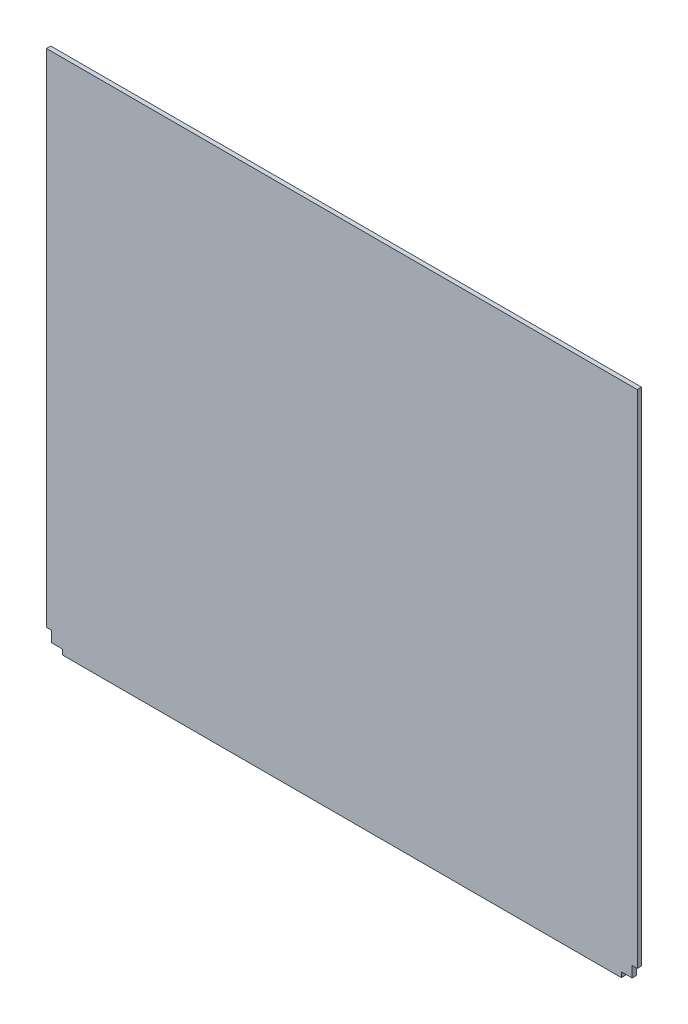
ISO-10303-21;
HEADER;
FILE_DESCRIPTION(('STEP AP214'),'2;1');
FILE_NAME('part.step','',(''),(''),'','','');
FILE_SCHEMA(('AUTOMOTIVE_DESIGN { 1 0 10303 214 1 1 1 1 }'));
ENDSEC;
DATA;
#1=APPLICATION_CONTEXT('core data for automotive mechanical design processes');
#2=APPLICATION_PROTOCOL_DEFINITION('international standard','automotive_design',2000,#1);
#3=PRODUCT_CONTEXT('',#1,'mechanical');
#4=PRODUCT('Part','Part','',(#3));
#5=PRODUCT_RELATED_PRODUCT_CATEGORY('part','',(#4));
#6=PRODUCT_DEFINITION_FORMATION('','',#4);
#7=PRODUCT_DEFINITION_CONTEXT('part definition',#1,'design');
#8=PRODUCT_DEFINITION('design','',#6,#7);
#9=PRODUCT_DEFINITION_SHAPE('','',#8);
#10=(LENGTH_UNIT() NAMED_UNIT(*) SI_UNIT(.MILLI.,.METRE.));
#11=(NAMED_UNIT(*) PLANE_ANGLE_UNIT() SI_UNIT($,.RADIAN.));
#12=(NAMED_UNIT(*) SI_UNIT($,.STERADIAN.) SOLID_ANGLE_UNIT());
#13=UNCERTAINTY_MEASURE_WITH_UNIT(LENGTH_MEASURE(1.E-05),#10,'distance_accuracy_value','');
#14=(GEOMETRIC_REPRESENTATION_CONTEXT(3) GLOBAL_UNCERTAINTY_ASSIGNED_CONTEXT((#13)) GLOBAL_UNIT_ASSIGNED_CONTEXT((#10,
#11,#12)) REPRESENTATION_CONTEXT('',''));
#15=CARTESIAN_POINT('',(0.,0.,0.));
#16=DIRECTION('',(0.,0.,1.));
#17=DIRECTION('',(1.,0.,0.));
#18=AXIS2_PLACEMENT_3D('',#15,#16,#17);
#19=CARTESIAN_POINT('',(0.,16.1250881688966,6.34999999999986));
#20=DIRECTION('',(1.,0.,0.));
#21=DIRECTION('',(0.,1.,0.));
#22=AXIS2_PLACEMENT_3D('',#19,#20,#21);
#23=PLANE('',#22);
#24=DIRECTION('',(0.,-1.,0.));
#25=VECTOR('',#24,1.);
#26=CARTESIAN_POINT('',(0.,16.1250881688966,0.));
#27=LINE('',#26,#25);
#28=CARTESIAN_POINT('',(0.,16.1250881688966,0.));
#29=VERTEX_POINT('',#28);
#30=CARTESIAN_POINT('',(0.,0.,0.));
#31=VERTEX_POINT('',#30);
#32=EDGE_CURVE('E166',#29,#31,#27,.T.);
#33=ORIENTED_EDGE('',*,*,#32,.T.);
#34=DIRECTION('',(0.,0.,-1.));
#35=VECTOR('',#34,1.);
#36=CARTESIAN_POINT('',(0.,0.,6.34999999999986));
#37=LINE('',#36,#35);
#38=CARTESIAN_POINT('',(0.,0.,6.34999999999986));
#39=VERTEX_POINT('',#38);
#40=EDGE_CURVE('E11',#39,#31,#37,.T.);
#41=ORIENTED_EDGE('',*,*,#40,.F.);
#42=DIRECTION('',(0.,-1.,0.));
#43=VECTOR('',#42,1.);
#44=CARTESIAN_POINT('',(0.,16.1250881688966,6.34999999999986));
#45=LINE('',#44,#43);
#46=CARTESIAN_POINT('',(0.,16.1250881688966,6.34999999999986));
#47=VERTEX_POINT('',#46);
#48=EDGE_CURVE('E200',#47,#39,#45,.T.);
#49=ORIENTED_EDGE('',*,*,#48,.F.);
#50=DIRECTION('',(0.,0.,-1.));
#51=VECTOR('',#50,1.);
#52=CARTESIAN_POINT('',(0.,16.1250881688966,6.34999999999986));
#53=LINE('',#52,#51);
#54=EDGE_CURVE('E162',#47,#29,#53,.T.);
#55=ORIENTED_EDGE('',*,*,#54,.T.);
#56=EDGE_LOOP('',(#33,#41,#49,#55));
#57=FACE_BOUND('',#56,.T.);
#58=ADVANCED_FACE('F40',(#57),#23,.F.);
#59=CARTESIAN_POINT('',(0.,0.,6.34999999999986));
#60=DIRECTION('',(0.,1.,0.));
#61=DIRECTION('',(0.,0.,1.));
#62=AXIS2_PLACEMENT_3D('',#59,#60,#61);
#63=PLANE('',#62);
#64=DIRECTION('',(1.,0.,0.));
#65=VECTOR('',#64,1.);
#66=CARTESIAN_POINT('',(0.,0.,0.));
#67=LINE('',#66,#65);
#68=CARTESIAN_POINT('',(16.1250881688966,0.,0.));
#69=VERTEX_POINT('',#68);
#70=EDGE_CURVE('E170',#31,#69,#67,.T.);
#71=ORIENTED_EDGE('',*,*,#70,.T.);
#72=DIRECTION('',(0.,0.,-1.));
#73=VECTOR('',#72,1.);
#74=CARTESIAN_POINT('',(16.1250881688966,0.,6.34999999999986));
#75=LINE('',#74,#73);
#76=CARTESIAN_POINT('',(16.1250881688966,0.,6.34999999999986));
#77=VERTEX_POINT('',#76);
#78=EDGE_CURVE('E49',#77,#69,#75,.T.);
#79=ORIENTED_EDGE('',*,*,#78,.F.);
#80=DIRECTION('',(1.,0.,0.));
#81=VECTOR('',#80,1.);
#82=CARTESIAN_POINT('',(0.,0.,6.34999999999986));
#83=LINE('',#82,#81);
#84=EDGE_CURVE('E112',#39,#77,#83,.T.);
#85=ORIENTED_EDGE('',*,*,#84,.F.);
#86=ORIENTED_EDGE('',*,*,#40,.T.);
#87=EDGE_LOOP('',(#71,#79,#85,#86));
#88=FACE_BOUND('',#87,.T.);
#89=ADVANCED_FACE('F301',(#88),#63,.F.);
#90=CARTESIAN_POINT('',(16.1250881688966,-7.61999999999996,6.34999999999986));
#91=DIRECTION('',(1.,0.,0.));
#92=DIRECTION('',(0.,0.,-1.));
#93=AXIS2_PLACEMENT_3D('',#90,#91,#92);
#94=PLANE('',#93);
#95=DIRECTION('',(0.,-1.,0.));
#96=VECTOR('',#95,1.);
#97=CARTESIAN_POINT('',(16.1250881688966,-7.61999999999996,0.));
#98=LINE('',#97,#96);
#99=CARTESIAN_POINT('',(16.1250881688966,-7.61999999999996,0.));
#100=VERTEX_POINT('',#99);
#101=EDGE_CURVE('E173',#69,#100,#98,.T.);
#102=ORIENTED_EDGE('',*,*,#101,.T.);
#103=DIRECTION('',(0.,0.,-1.));
#104=VECTOR('',#103,1.);
#105=CARTESIAN_POINT('',(16.1250881688966,-7.61999999999996,6.34999999999986));
#106=LINE('',#105,#104);
#107=CARTESIAN_POINT('',(16.1250881688966,-7.61999999999996,6.34999999999986));
#108=VERTEX_POINT('',#107);
#109=EDGE_CURVE('E227',#108,#100,#106,.T.);
#110=ORIENTED_EDGE('',*,*,#109,.F.);
#111=DIRECTION('',(0.,-1.,0.));
#112=VECTOR('',#111,1.);
#113=CARTESIAN_POINT('',(16.1250881688966,-7.61999999999996,6.34999999999986));
#114=LINE('',#113,#112);
#115=EDGE_CURVE('E238',#77,#108,#114,.T.);
#116=ORIENTED_EDGE('',*,*,#115,.F.);
#117=ORIENTED_EDGE('',*,*,#78,.T.);
#118=EDGE_LOOP('',(#102,#110,#116,#117));
#119=FACE_BOUND('',#118,.T.);
#120=ADVANCED_FACE('F236',(#119),#94,.F.);
#121=CARTESIAN_POINT('',(848.236911831105,-7.61999999999985,6.3500000000003));
#122=DIRECTION('',(0.,1.,0.));
#123=DIRECTION('',(-1.,0.,0.));
#124=AXIS2_PLACEMENT_3D('',#121,#122,#123);
#125=PLANE('',#124);
#126=DIRECTION('',(1.,0.,0.));
#127=VECTOR('',#126,1.);
#128=CARTESIAN_POINT('',(848.236911831105,-7.61999999999985,0.));
#129=LINE('',#128,#127);
#130=CARTESIAN_POINT('',(848.236911831105,-7.61999999999985,0.));
#131=VERTEX_POINT('',#130);
#132=EDGE_CURVE('E176',#100,#131,#129,.T.);
#133=ORIENTED_EDGE('',*,*,#132,.T.);
#134=DIRECTION('',(0.,0.,-1.));
#135=VECTOR('',#134,1.);
#136=CARTESIAN_POINT('',(848.236911831105,-7.61999999999985,6.3500000000003));
#137=LINE('',#136,#135);
#138=CARTESIAN_POINT('',(848.236911831105,-7.61999999999985,6.3500000000003));
#139=VERTEX_POINT('',#138);
#140=EDGE_CURVE('E223',#139,#131,#137,.T.);
#141=ORIENTED_EDGE('',*,*,#140,.F.);
#142=DIRECTION('',(1.,0.,0.));
#143=VECTOR('',#142,1.);
#144=CARTESIAN_POINT('',(848.236911831105,-7.61999999999985,6.3500000000003));
#145=LINE('',#144,#143);
#146=EDGE_CURVE('E257',#108,#139,#145,.T.);
#147=ORIENTED_EDGE('',*,*,#146,.F.);
#148=ORIENTED_EDGE('',*,*,#109,.T.);
#149=EDGE_LOOP('',(#133,#141,#147,#148));
#150=FACE_BOUND('',#149,.T.);
#151=ADVANCED_FACE('F247',(#150),#125,.F.);
#152=CARTESIAN_POINT('',(848.236911831105,-7.61999999999985,6.3500000000003));
#153=DIRECTION('',(-1.,0.,0.));
#154=DIRECTION('',(0.,0.,1.));
#155=AXIS2_PLACEMENT_3D('',#152,#153,#154);
#156=PLANE('',#155);
#157=DIRECTION('',(0.,1.,0.));
#158=VECTOR('',#157,1.);
#159=CARTESIAN_POINT('',(848.236911831105,-7.61999999999985,0.));
#160=LINE('',#159,#158);
#161=CARTESIAN_POINT('',(848.236911831105,2.22044604925031E-13,0.));
#162=VERTEX_POINT('',#161);
#163=EDGE_CURVE('E179',#131,#162,#160,.T.);
#164=ORIENTED_EDGE('',*,*,#163,.T.);
#165=DIRECTION('',(0.,0.,-1.));
#166=VECTOR('',#165,1.);
#167=CARTESIAN_POINT('',(848.236911831105,2.22044604925031E-13,6.3500000000003));
#168=LINE('',#167,#166);
#169=CARTESIAN_POINT('',(848.236911831105,2.22044604925031E-13,6.3500000000003));
#170=VERTEX_POINT('',#169);
#171=EDGE_CURVE('E219',#170,#162,#168,.T.);
#172=ORIENTED_EDGE('',*,*,#171,.F.);
#173=DIRECTION('',(0.,1.,0.));
#174=VECTOR('',#173,1.);
#175=CARTESIAN_POINT('',(848.236911831105,-7.61999999999985,6.3500000000003));
#176=LINE('',#175,#174);
#177=EDGE_CURVE('E253',#139,#170,#176,.T.);
#178=ORIENTED_EDGE('',*,*,#177,.F.);
#179=ORIENTED_EDGE('',*,*,#140,.T.);
#180=EDGE_LOOP('',(#164,#172,#178,#179));
#181=FACE_BOUND('',#180,.T.);
#182=ADVANCED_FACE('F251',(#181),#156,.F.);
#183=CARTESIAN_POINT('',(864.362000000002,2.22044604925031E-13,6.34999999999941));
#184=DIRECTION('',(0.,1.,0.));
#185=DIRECTION('',(-1.,0.,0.));
#186=AXIS2_PLACEMENT_3D('',#183,#184,#185);
#187=PLANE('',#186);
#188=DIRECTION('',(1.,0.,0.));
#189=VECTOR('',#188,1.);
#190=CARTESIAN_POINT('',(864.362000000002,2.22044604925031E-13,-8.88178419700125E-13));
#191=LINE('',#190,#189);
#192=CARTESIAN_POINT('',(864.362000000002,2.22044604925031E-13,-8.88178419700125E-13));
#193=VERTEX_POINT('',#192);
#194=EDGE_CURVE('E182',#162,#193,#191,.T.);
#195=ORIENTED_EDGE('',*,*,#194,.T.);
#196=DIRECTION('',(0.,0.,-1.));
#197=VECTOR('',#196,1.);
#198=CARTESIAN_POINT('',(864.362000000002,2.22044604925031E-13,6.34999999999941));
#199=LINE('',#198,#197);
#200=CARTESIAN_POINT('',(864.362000000002,2.22044604925031E-13,6.34999999999941));
#201=VERTEX_POINT('',#200);
#202=EDGE_CURVE('E215',#201,#193,#199,.T.);
#203=ORIENTED_EDGE('',*,*,#202,.F.);
#204=DIRECTION('',(1.,0.,0.));
#205=VECTOR('',#204,1.);
#206=CARTESIAN_POINT('',(864.362000000002,2.22044604925031E-13,6.34999999999941));
#207=LINE('',#206,#205);
#208=EDGE_CURVE('E256',#170,#201,#207,.T.);
#209=ORIENTED_EDGE('',*,*,#208,.F.);
#210=ORIENTED_EDGE('',*,*,#171,.T.);
#211=EDGE_LOOP('',(#195,#203,#209,#210));
#212=FACE_BOUND('',#211,.T.);
#213=ADVANCED_FACE('F314',(#212),#187,.F.);
#214=CARTESIAN_POINT('',(864.362000000002,16.1250881688968,6.34999999999941));
#215=DIRECTION('',(-1.,0.,0.));
#216=DIRECTION('',(0.,0.,1.));
#217=AXIS2_PLACEMENT_3D('',#214,#215,#216);
#218=PLANE('',#217);
#219=DIRECTION('',(0.,1.,0.));
#220=VECTOR('',#219,1.);
#221=CARTESIAN_POINT('',(864.362000000002,16.1250881688968,-8.88178419700125E-13));
#222=LINE('',#221,#220);
#223=CARTESIAN_POINT('',(864.362000000002,16.1250881688968,-8.88178419700125E-13));
#224=VERTEX_POINT('',#223);
#225=EDGE_CURVE('E185',#193,#224,#222,.T.);
#226=ORIENTED_EDGE('',*,*,#225,.T.);
#227=DIRECTION('',(0.,0.,-1.));
#228=VECTOR('',#227,1.);
#229=CARTESIAN_POINT('',(864.362000000002,16.1250881688968,6.34999999999941));
#230=LINE('',#229,#228);
#231=CARTESIAN_POINT('',(864.362000000002,16.1250881688968,6.34999999999941));
#232=VERTEX_POINT('',#231);
#233=EDGE_CURVE('E211',#232,#224,#230,.T.);
#234=ORIENTED_EDGE('',*,*,#233,.F.);
#235=DIRECTION('',(0.,1.,0.));
#236=VECTOR('',#235,1.);
#237=CARTESIAN_POINT('',(864.362000000002,16.1250881688968,6.34999999999941));
#238=LINE('',#237,#236);
#239=EDGE_CURVE('E262',#201,#232,#238,.T.);
#240=ORIENTED_EDGE('',*,*,#239,.F.);
#241=ORIENTED_EDGE('',*,*,#202,.T.);
#242=EDGE_LOOP('',(#226,#234,#240,#241));
#243=FACE_BOUND('',#242,.T.);
#244=ADVANCED_FACE('F317',(#243),#218,.F.);
#245=CARTESIAN_POINT('',(864.362000000002,16.1250881688968,6.34999999999941));
#246=DIRECTION('',(0.,1.,0.));
#247=DIRECTION('',(-1.,0.,0.));
#248=AXIS2_PLACEMENT_3D('',#245,#246,#247);
#249=PLANE('',#248);
#250=DIRECTION('',(1.,0.,0.));
#251=VECTOR('',#250,1.);
#252=CARTESIAN_POINT('',(864.362000000002,16.1250881688968,-8.88178419700125E-13));
#253=LINE('',#252,#251);
#254=CARTESIAN_POINT('',(871.982000000002,16.1250881688968,-8.88178419700125E-13));
#255=VERTEX_POINT('',#254);
#256=EDGE_CURVE('E188',#224,#255,#253,.T.);
#257=ORIENTED_EDGE('',*,*,#256,.T.);
#258=DIRECTION('',(0.,0.,-1.));
#259=VECTOR('',#258,1.);
#260=CARTESIAN_POINT('',(871.982000000002,16.1250881688968,6.34999999999941));
#261=LINE('',#260,#259);
#262=CARTESIAN_POINT('',(871.982000000002,16.1250881688968,6.34999999999941));
#263=VERTEX_POINT('',#262);
#264=EDGE_CURVE('E207',#263,#255,#261,.T.);
#265=ORIENTED_EDGE('',*,*,#264,.F.);
#266=DIRECTION('',(1.,0.,0.));
#267=VECTOR('',#266,1.);
#268=CARTESIAN_POINT('',(864.362000000002,16.1250881688968,6.34999999999941));
#269=LINE('',#268,#267);
#270=EDGE_CURVE('E269',#232,#263,#269,.T.);
#271=ORIENTED_EDGE('',*,*,#270,.F.);
#272=ORIENTED_EDGE('',*,*,#233,.T.);
#273=EDGE_LOOP('',(#257,#265,#271,#272));
#274=FACE_BOUND('',#273,.T.);
#275=ADVANCED_FACE('F282',(#274),#249,.F.);
#276=CARTESIAN_POINT('',(871.982000000001,762.508,6.34999999999941));
#277=DIRECTION('',(-1.,0.,0.));
#278=DIRECTION('',(0.,-1.,0.));
#279=AXIS2_PLACEMENT_3D('',#276,#277,#278);
#280=PLANE('',#279);
#281=DIRECTION('',(0.,1.,0.));
#282=VECTOR('',#281,1.);
#283=CARTESIAN_POINT('',(871.982000000001,762.508,-8.88178419700125E-13));
#284=LINE('',#283,#282);
#285=CARTESIAN_POINT('',(871.982000000001,762.508,-8.88178419700125E-13));
#286=VERTEX_POINT('',#285);
#287=EDGE_CURVE('E191',#255,#286,#284,.T.);
#288=ORIENTED_EDGE('',*,*,#287,.T.);
#289=DIRECTION('',(0.,0.,-1.));
#290=VECTOR('',#289,1.);
#291=CARTESIAN_POINT('',(871.982000000001,762.508,6.34999999999941));
#292=LINE('',#291,#290);
#293=CARTESIAN_POINT('',(871.982000000001,762.508,6.34999999999941));
#294=VERTEX_POINT('',#293);
#295=EDGE_CURVE('E154',#294,#286,#292,.T.);
#296=ORIENTED_EDGE('',*,*,#295,.F.);
#297=DIRECTION('',(0.,1.,0.));
#298=VECTOR('',#297,1.);
#299=CARTESIAN_POINT('',(871.982000000001,762.508,6.34999999999941));
#300=LINE('',#299,#298);
#301=EDGE_CURVE('E143',#263,#294,#300,.T.);
#302=ORIENTED_EDGE('',*,*,#301,.F.);
#303=ORIENTED_EDGE('',*,*,#264,.T.);
#304=EDGE_LOOP('',(#288,#296,#302,#303));
#305=FACE_BOUND('',#304,.T.);
#306=ADVANCED_FACE('F286',(#305),#280,.F.);
#307=CARTESIAN_POINT('',(-7.62000000000001,762.508,6.34999999999986));
#308=DIRECTION('',(0.,-1.,0.));
#309=DIRECTION('',(1.,0.,0.));
#310=AXIS2_PLACEMENT_3D('',#307,#308,#309);
#311=PLANE('',#310);
#312=DIRECTION('',(-1.,0.,0.));
#313=VECTOR('',#312,1.);
#314=CARTESIAN_POINT('',(-7.62000000000002,762.508,0.));
#315=LINE('',#314,#313);
#316=CARTESIAN_POINT('',(-7.62000000000002,762.508,0.));
#317=VERTEX_POINT('',#316);
#318=EDGE_CURVE('E152',#286,#317,#315,.T.);
#319=ORIENTED_EDGE('',*,*,#318,.T.);
#320=DIRECTION('',(0.,0.,-1.));
#321=VECTOR('',#320,1.);
#322=CARTESIAN_POINT('',(-7.62000000000001,762.508,6.34999999999986));
#323=LINE('',#322,#321);
#324=CARTESIAN_POINT('',(-7.62000000000001,762.508,6.34999999999986));
#325=VERTEX_POINT('',#324);
#326=EDGE_CURVE('E149',#325,#317,#323,.T.);
#327=ORIENTED_EDGE('',*,*,#326,.F.);
#328=DIRECTION('',(-1.,0.,0.));
#329=VECTOR('',#328,1.);
#330=CARTESIAN_POINT('',(-7.62000000000001,762.508,6.34999999999986));
#331=LINE('',#330,#329);
#332=EDGE_CURVE('E137',#294,#325,#331,.T.);
#333=ORIENTED_EDGE('',*,*,#332,.F.);
#334=ORIENTED_EDGE('',*,*,#295,.T.);
#335=EDGE_LOOP('',(#319,#327,#333,#334));
#336=FACE_BOUND('',#335,.T.);
#337=ADVANCED_FACE('F150',(#336),#311,.F.);
#338=CARTESIAN_POINT('',(-7.62000000000001,16.1250881688966,6.34999999999986));
#339=DIRECTION('',(1.,0.,0.));
#340=DIRECTION('',(0.,1.,0.));
#341=AXIS2_PLACEMENT_3D('',#338,#339,#340);
#342=PLANE('',#341);
#343=DIRECTION('',(0.,-1.,0.));
#344=VECTOR('',#343,1.);
#345=CARTESIAN_POINT('',(-7.62000000000002,16.1250881688966,0.));
#346=LINE('',#345,#344);
#347=CARTESIAN_POINT('',(-7.62000000000002,16.1250881688966,0.));
#348=VERTEX_POINT('',#347);
#349=EDGE_CURVE('E98',#317,#348,#346,.T.);
#350=ORIENTED_EDGE('',*,*,#349,.T.);
#351=DIRECTION('',(0.,0.,-1.));
#352=VECTOR('',#351,1.);
#353=CARTESIAN_POINT('',(-7.62000000000001,16.1250881688966,6.34999999999986));
#354=LINE('',#353,#352);
#355=CARTESIAN_POINT('',(-7.62000000000001,16.1250881688966,6.34999999999986));
#356=VERTEX_POINT('',#355);
#357=EDGE_CURVE('E155',#356,#348,#354,.T.);
#358=ORIENTED_EDGE('',*,*,#357,.F.);
#359=DIRECTION('',(0.,-1.,0.));
#360=VECTOR('',#359,1.);
#361=CARTESIAN_POINT('',(-7.62000000000001,16.1250881688966,6.34999999999986));
#362=LINE('',#361,#360);
#363=EDGE_CURVE('E141',#325,#356,#362,.T.);
#364=ORIENTED_EDGE('',*,*,#363,.F.);
#365=ORIENTED_EDGE('',*,*,#326,.T.);
#366=EDGE_LOOP('',(#350,#358,#364,#365));
#367=FACE_BOUND('',#366,.T.);
#368=ADVANCED_FACE('F157',(#367),#342,.F.);
#369=CARTESIAN_POINT('',(0.,16.1250881688966,6.34999999999986));
#370=DIRECTION('',(0.,1.,0.));
#371=DIRECTION('',(0.,0.,1.));
#372=AXIS2_PLACEMENT_3D('',#369,#370,#371);
#373=PLANE('',#372);
#374=DIRECTION('',(1.,0.,0.));
#375=VECTOR('',#374,1.);
#376=CARTESIAN_POINT('',(0.,16.1250881688966,0.));
#377=LINE('',#376,#375);
#378=EDGE_CURVE('E104',#348,#29,#377,.T.);
#379=ORIENTED_EDGE('',*,*,#378,.T.);
#380=ORIENTED_EDGE('',*,*,#54,.F.);
#381=DIRECTION('',(1.,0.,0.));
#382=VECTOR('',#381,1.);
#383=CARTESIAN_POINT('',(0.,16.1250881688966,6.34999999999986));
#384=LINE('',#383,#382);
#385=EDGE_CURVE('E57',#356,#47,#384,.T.);
#386=ORIENTED_EDGE('',*,*,#385,.F.);
#387=ORIENTED_EDGE('',*,*,#357,.T.);
#388=EDGE_LOOP('',(#379,#380,#386,#387));
#389=FACE_BOUND('',#388,.T.);
#390=ADVANCED_FACE('F290',(#389),#373,.F.);
#391=CARTESIAN_POINT('',(0.,0.,6.34999999999986));
#392=DIRECTION('',(0.,0.,1.));
#393=DIRECTION('',(1.,0.,0.));
#394=AXIS2_PLACEMENT_3D('',#391,#392,#393);
#395=PLANE('',#394);
#396=ORIENTED_EDGE('',*,*,#48,.T.);
#397=ORIENTED_EDGE('',*,*,#84,.T.);
#398=ORIENTED_EDGE('',*,*,#115,.T.);
#399=ORIENTED_EDGE('',*,*,#146,.T.);
#400=ORIENTED_EDGE('',*,*,#177,.T.);
#401=ORIENTED_EDGE('',*,*,#208,.T.);
#402=ORIENTED_EDGE('',*,*,#239,.T.);
#403=ORIENTED_EDGE('',*,*,#270,.T.);
#404=ORIENTED_EDGE('',*,*,#301,.T.);
#405=ORIENTED_EDGE('',*,*,#332,.T.);
#406=ORIENTED_EDGE('',*,*,#363,.T.);
#407=ORIENTED_EDGE('',*,*,#385,.T.);
#408=EDGE_LOOP('',(#396,#397,#398,#399,#400,#401,#402,#403,#404,#405,#406,#407));
#409=FACE_BOUND('',#408,.T.);
#410=ADVANCED_FACE('F139',(#409),#395,.T.);
#411=CARTESIAN_POINT('',(0.,0.,0.));
#412=DIRECTION('',(0.,0.,1.));
#413=DIRECTION('',(1.,0.,0.));
#414=AXIS2_PLACEMENT_3D('',#411,#412,#413);
#415=PLANE('',#414);
#416=ORIENTED_EDGE('',*,*,#32,.F.);
#417=ORIENTED_EDGE('',*,*,#378,.F.);
#418=ORIENTED_EDGE('',*,*,#349,.F.);
#419=ORIENTED_EDGE('',*,*,#318,.F.);
#420=ORIENTED_EDGE('',*,*,#287,.F.);
#421=ORIENTED_EDGE('',*,*,#256,.F.);
#422=ORIENTED_EDGE('',*,*,#225,.F.);
#423=ORIENTED_EDGE('',*,*,#194,.F.);
#424=ORIENTED_EDGE('',*,*,#163,.F.);
#425=ORIENTED_EDGE('',*,*,#132,.F.);
#426=ORIENTED_EDGE('',*,*,#101,.F.);
#427=ORIENTED_EDGE('',*,*,#70,.F.);
#428=EDGE_LOOP('',(#416,#417,#418,#419,#420,#421,#422,#423,#424,#425,#426,#427));
#429=FACE_BOUND('',#428,.T.);
#430=ADVANCED_FACE('F242',(#429),#415,.F.);
#431=CLOSED_SHELL('',(#58,#89,#120,#151,#182,#213,#244,#275,#306,#337,#368,#390,#410,#430));
#432=MANIFOLD_SOLID_BREP('B2',#431);
#433=ADVANCED_BREP_SHAPE_REPRESENTATION('',(#18,#432),#14);
#434=SHAPE_DEFINITION_REPRESENTATION(#9,#433);
ENDSEC;
END-ISO-10303-21;
